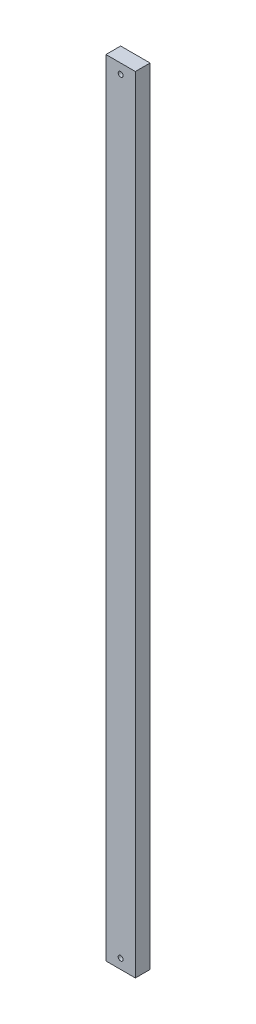
ISO-10303-21;
HEADER;
FILE_DESCRIPTION(('STEP AP214'),'2;1');
FILE_NAME('part.step','',(''),(''),'','','');
FILE_SCHEMA(('AUTOMOTIVE_DESIGN { 1 0 10303 214 1 1 1 1 }'));
ENDSEC;
DATA;
#1=APPLICATION_CONTEXT('core data for automotive mechanical design processes');
#2=APPLICATION_PROTOCOL_DEFINITION('international standard','automotive_design',2000,#1);
#3=PRODUCT_CONTEXT('',#1,'mechanical');
#4=PRODUCT('Part','Part','',(#3));
#5=PRODUCT_RELATED_PRODUCT_CATEGORY('part','',(#4));
#6=PRODUCT_DEFINITION_FORMATION('','',#4);
#7=PRODUCT_DEFINITION_CONTEXT('part definition',#1,'design');
#8=PRODUCT_DEFINITION('design','',#6,#7);
#9=PRODUCT_DEFINITION_SHAPE('','',#8);
#10=(LENGTH_UNIT() NAMED_UNIT(*) SI_UNIT(.MILLI.,.METRE.));
#11=(NAMED_UNIT(*) PLANE_ANGLE_UNIT() SI_UNIT($,.RADIAN.));
#12=(NAMED_UNIT(*) SI_UNIT($,.STERADIAN.) SOLID_ANGLE_UNIT());
#13=UNCERTAINTY_MEASURE_WITH_UNIT(LENGTH_MEASURE(1.E-05),#10,'distance_accuracy_value','');
#14=(GEOMETRIC_REPRESENTATION_CONTEXT(3) GLOBAL_UNCERTAINTY_ASSIGNED_CONTEXT((#13)) GLOBAL_UNIT_ASSIGNED_CONTEXT((#10,
#11,#12)) REPRESENTATION_CONTEXT('',''));
#15=CARTESIAN_POINT('',(0.,0.,0.));
#16=DIRECTION('',(0.,0.,1.));
#17=DIRECTION('',(1.,0.,0.));
#18=AXIS2_PLACEMENT_3D('',#15,#16,#17);
#19=CARTESIAN_POINT('',(-19.05,1016.,-9.525));
#20=DIRECTION('',(1.,0.,0.));
#21=DIRECTION('',(0.,0.,-1.));
#22=AXIS2_PLACEMENT_3D('',#19,#20,#21);
#23=PLANE('',#22);
#24=DIRECTION('',(0.,0.,1.));
#25=VECTOR('',#24,1.);
#26=CARTESIAN_POINT('',(-19.05,0.,-9.525));
#27=LINE('',#26,#25);
#28=CARTESIAN_POINT('',(-19.05,0.,-9.525));
#29=VERTEX_POINT('',#28);
#30=CARTESIAN_POINT('',(-19.05,0.,9.525));
#31=VERTEX_POINT('',#30);
#32=EDGE_CURVE('E99',#29,#31,#27,.T.);
#33=ORIENTED_EDGE('',*,*,#32,.T.);
#34=DIRECTION('',(0.,-1.,0.));
#35=VECTOR('',#34,1.);
#36=CARTESIAN_POINT('',(-19.05,1016.,9.525));
#37=LINE('',#36,#35);
#38=CARTESIAN_POINT('',(-19.05,1016.,9.525));
#39=VERTEX_POINT('',#38);
#40=EDGE_CURVE('E11',#39,#31,#37,.T.);
#41=ORIENTED_EDGE('',*,*,#40,.F.);
#42=DIRECTION('',(0.,0.,1.));
#43=VECTOR('',#42,1.);
#44=CARTESIAN_POINT('',(-19.05,1016.,-9.525));
#45=LINE('',#44,#43);
#46=CARTESIAN_POINT('',(-19.05,1016.,-9.525));
#47=VERTEX_POINT('',#46);
#48=EDGE_CURVE('E86',#47,#39,#45,.T.);
#49=ORIENTED_EDGE('',*,*,#48,.F.);
#50=DIRECTION('',(0.,-1.,0.));
#51=VECTOR('',#50,1.);
#52=CARTESIAN_POINT('',(-19.05,1016.,-9.525));
#53=LINE('',#52,#51);
#54=EDGE_CURVE('E95',#47,#29,#53,.T.);
#55=ORIENTED_EDGE('',*,*,#54,.T.);
#56=EDGE_LOOP('',(#33,#41,#49,#55));
#57=FACE_BOUND('',#56,.T.);
#58=ADVANCED_FACE('F33',(#57),#23,.F.);
#59=CARTESIAN_POINT('',(19.05,1016.,9.525));
#60=DIRECTION('',(0.,0.,-1.));
#61=DIRECTION('',(-1.,0.,0.));
#62=AXIS2_PLACEMENT_3D('',#59,#60,#61);
#63=PLANE('',#62);
#64=CARTESIAN_POINT('',(0.,1003.3,9.525));
#65=DIRECTION('',(0.,0.,1.));
#66=DIRECTION('',(1.,0.,0.));
#67=AXIS2_PLACEMENT_3D('',#64,#65,#66);
#68=CIRCLE('',#67,3.17500000000006);
#69=CARTESIAN_POINT('',(3.17500000000006,1003.3,9.525));
#70=VERTEX_POINT('',#69);
#71=EDGE_CURVE('E116',#70,#70,#68,.T.);
#72=ORIENTED_EDGE('',*,*,#71,.F.);
#73=EDGE_LOOP('',(#72));
#74=FACE_BOUND('',#73,.T.);
#75=CARTESIAN_POINT('',(0.,12.6999999999999,9.525));
#76=DIRECTION('',(0.,0.,1.));
#77=DIRECTION('',(1.,0.,0.));
#78=AXIS2_PLACEMENT_3D('',#75,#76,#77);
#79=CIRCLE('',#78,3.175);
#80=CARTESIAN_POINT('',(3.175,12.6999999999999,9.525));
#81=VERTEX_POINT('',#80);
#82=EDGE_CURVE('E108',#81,#81,#79,.T.);
#83=ORIENTED_EDGE('',*,*,#82,.F.);
#84=EDGE_LOOP('',(#83));
#85=FACE_BOUND('',#84,.T.);
#86=DIRECTION('',(1.,0.,0.));
#87=VECTOR('',#86,1.);
#88=CARTESIAN_POINT('',(19.05,0.,9.525));
#89=LINE('',#88,#87);
#90=CARTESIAN_POINT('',(19.05,0.,9.525));
#91=VERTEX_POINT('',#90);
#92=EDGE_CURVE('E90',#31,#91,#89,.T.);
#93=ORIENTED_EDGE('',*,*,#92,.T.);
#94=DIRECTION('',(0.,-1.,0.));
#95=VECTOR('',#94,1.);
#96=CARTESIAN_POINT('',(19.05,1016.,9.525));
#97=LINE('',#96,#95);
#98=CARTESIAN_POINT('',(19.05,1016.,9.525));
#99=VERTEX_POINT('',#98);
#100=EDGE_CURVE('E42',#99,#91,#97,.T.);
#101=ORIENTED_EDGE('',*,*,#100,.F.);
#102=DIRECTION('',(1.,0.,0.));
#103=VECTOR('',#102,1.);
#104=CARTESIAN_POINT('',(19.05,1016.,9.525));
#105=LINE('',#104,#103);
#106=EDGE_CURVE('E81',#39,#99,#105,.T.);
#107=ORIENTED_EDGE('',*,*,#106,.F.);
#108=ORIENTED_EDGE('',*,*,#40,.T.);
#109=EDGE_LOOP('',(#93,#101,#107,#108));
#110=FACE_BOUND('',#109,.T.);
#111=ADVANCED_FACE('F89',(#74,#85,#110),#63,.F.);
#112=CARTESIAN_POINT('',(19.05,1016.,-9.525));
#113=DIRECTION('',(-1.,0.,0.));
#114=DIRECTION('',(0.,0.,1.));
#115=AXIS2_PLACEMENT_3D('',#112,#113,#114);
#116=PLANE('',#115);
#117=DIRECTION('',(0.,0.,-1.));
#118=VECTOR('',#117,1.);
#119=CARTESIAN_POINT('',(19.05,0.,-9.525));
#120=LINE('',#119,#118);
#121=CARTESIAN_POINT('',(19.05,0.,-9.525));
#122=VERTEX_POINT('',#121);
#123=EDGE_CURVE('E68',#91,#122,#120,.T.);
#124=ORIENTED_EDGE('',*,*,#123,.T.);
#125=DIRECTION('',(0.,-1.,0.));
#126=VECTOR('',#125,1.);
#127=CARTESIAN_POINT('',(19.05,1016.,-9.525));
#128=LINE('',#127,#126);
#129=CARTESIAN_POINT('',(19.05,1016.,-9.525));
#130=VERTEX_POINT('',#129);
#131=EDGE_CURVE('E91',#130,#122,#128,.T.);
#132=ORIENTED_EDGE('',*,*,#131,.F.);
#133=DIRECTION('',(0.,0.,-1.));
#134=VECTOR('',#133,1.);
#135=CARTESIAN_POINT('',(19.05,1016.,-9.525));
#136=LINE('',#135,#134);
#137=EDGE_CURVE('E84',#99,#130,#136,.T.);
#138=ORIENTED_EDGE('',*,*,#137,.F.);
#139=ORIENTED_EDGE('',*,*,#100,.T.);
#140=EDGE_LOOP('',(#124,#132,#138,#139));
#141=FACE_BOUND('',#140,.T.);
#142=ADVANCED_FACE('F93',(#141),#116,.F.);
#143=CARTESIAN_POINT('',(19.05,1016.,-9.525));
#144=DIRECTION('',(0.,0.,1.));
#145=DIRECTION('',(1.,0.,0.));
#146=AXIS2_PLACEMENT_3D('',#143,#144,#145);
#147=PLANE('',#146);
#148=CARTESIAN_POINT('',(0.,1003.3,-9.52500000000001));
#149=DIRECTION('',(0.,0.,1.));
#150=DIRECTION('',(1.,0.,0.));
#151=AXIS2_PLACEMENT_3D('',#148,#149,#150);
#152=CIRCLE('',#151,3.17500000000006);
#153=CARTESIAN_POINT('',(3.17500000000006,1003.3,-9.52500000000001));
#154=VERTEX_POINT('',#153);
#155=EDGE_CURVE('E36',#154,#154,#152,.T.);
#156=ORIENTED_EDGE('',*,*,#155,.T.);
#157=EDGE_LOOP('',(#156));
#158=FACE_BOUND('',#157,.T.);
#159=CARTESIAN_POINT('',(0.,12.6999999999999,-9.52500000000001));
#160=DIRECTION('',(0.,0.,1.));
#161=DIRECTION('',(1.,0.,0.));
#162=AXIS2_PLACEMENT_3D('',#159,#160,#161);
#163=CIRCLE('',#162,3.175);
#164=CARTESIAN_POINT('',(3.175,12.6999999999999,-9.52500000000001));
#165=VERTEX_POINT('',#164);
#166=EDGE_CURVE('E102',#165,#165,#163,.T.);
#167=ORIENTED_EDGE('',*,*,#166,.T.);
#168=EDGE_LOOP('',(#167));
#169=FACE_BOUND('',#168,.T.);
#170=DIRECTION('',(-1.,0.,0.));
#171=VECTOR('',#170,1.);
#172=CARTESIAN_POINT('',(19.05,0.,-9.525));
#173=LINE('',#172,#171);
#174=EDGE_CURVE('E74',#122,#29,#173,.T.);
#175=ORIENTED_EDGE('',*,*,#174,.T.);
#176=ORIENTED_EDGE('',*,*,#54,.F.);
#177=DIRECTION('',(-1.,0.,0.));
#178=VECTOR('',#177,1.);
#179=CARTESIAN_POINT('',(19.05,1016.,-9.525));
#180=LINE('',#179,#178);
#181=EDGE_CURVE('E51',#130,#47,#180,.T.);
#182=ORIENTED_EDGE('',*,*,#181,.F.);
#183=ORIENTED_EDGE('',*,*,#131,.T.);
#184=EDGE_LOOP('',(#175,#176,#182,#183));
#185=FACE_BOUND('',#184,.T.);
#186=ADVANCED_FACE('F130',(#158,#169,#185),#147,.F.);
#187=CARTESIAN_POINT('',(0.,1016.,0.));
#188=DIRECTION('',(0.,-1.,0.));
#189=DIRECTION('',(0.,0.,-1.));
#190=AXIS2_PLACEMENT_3D('',#187,#188,#189);
#191=PLANE('',#190);
#192=ORIENTED_EDGE('',*,*,#48,.T.);
#193=ORIENTED_EDGE('',*,*,#106,.T.);
#194=ORIENTED_EDGE('',*,*,#137,.T.);
#195=ORIENTED_EDGE('',*,*,#181,.T.);
#196=EDGE_LOOP('',(#192,#193,#194,#195));
#197=FACE_BOUND('',#196,.T.);
#198=ADVANCED_FACE('F82',(#197),#191,.F.);
#199=CARTESIAN_POINT('',(0.,0.,0.));
#200=DIRECTION('',(0.,-1.,0.));
#201=DIRECTION('',(0.,0.,-1.));
#202=AXIS2_PLACEMENT_3D('',#199,#200,#201);
#203=PLANE('',#202);
#204=ORIENTED_EDGE('',*,*,#32,.F.);
#205=ORIENTED_EDGE('',*,*,#174,.F.);
#206=ORIENTED_EDGE('',*,*,#123,.F.);
#207=ORIENTED_EDGE('',*,*,#92,.F.);
#208=EDGE_LOOP('',(#204,#205,#206,#207));
#209=FACE_BOUND('',#208,.T.);
#210=ADVANCED_FACE('F137',(#209),#203,.T.);
#211=CARTESIAN_POINT('',(0.,12.6999999999999,-1006.475));
#212=DIRECTION('',(0.,0.,1.));
#213=DIRECTION('',(1.,0.,0.));
#214=AXIS2_PLACEMENT_3D('',#211,#212,#213);
#215=CYLINDRICAL_SURFACE('',#214,3.175);
#216=ORIENTED_EDGE('',*,*,#82,.T.);
#217=EDGE_LOOP('',(#216));
#218=FACE_BOUND('',#217,.T.);
#219=ORIENTED_EDGE('',*,*,#166,.F.);
#220=EDGE_LOOP('',(#219));
#221=FACE_BOUND('',#220,.T.);
#222=ADVANCED_FACE('F140',(#218,#221),#215,.F.);
#223=CARTESIAN_POINT('',(0.,1003.3,-1006.475));
#224=DIRECTION('',(0.,0.,1.));
#225=DIRECTION('',(1.,0.,0.));
#226=AXIS2_PLACEMENT_3D('',#223,#224,#225);
#227=CYLINDRICAL_SURFACE('',#226,3.17500000000006);
#228=ORIENTED_EDGE('',*,*,#71,.T.);
#229=EDGE_LOOP('',(#228));
#230=FACE_BOUND('',#229,.T.);
#231=ORIENTED_EDGE('',*,*,#155,.F.);
#232=EDGE_LOOP('',(#231));
#233=FACE_BOUND('',#232,.T.);
#234=ADVANCED_FACE('F121',(#230,#233),#227,.F.);
#235=CLOSED_SHELL('',(#58,#111,#142,#186,#198,#210,#222,#234));
#236=MANIFOLD_SOLID_BREP('B2',#235);
#237=ADVANCED_BREP_SHAPE_REPRESENTATION('',(#18,#236),#14);
#238=SHAPE_DEFINITION_REPRESENTATION(#9,#237);
ENDSEC;
END-ISO-10303-21;
